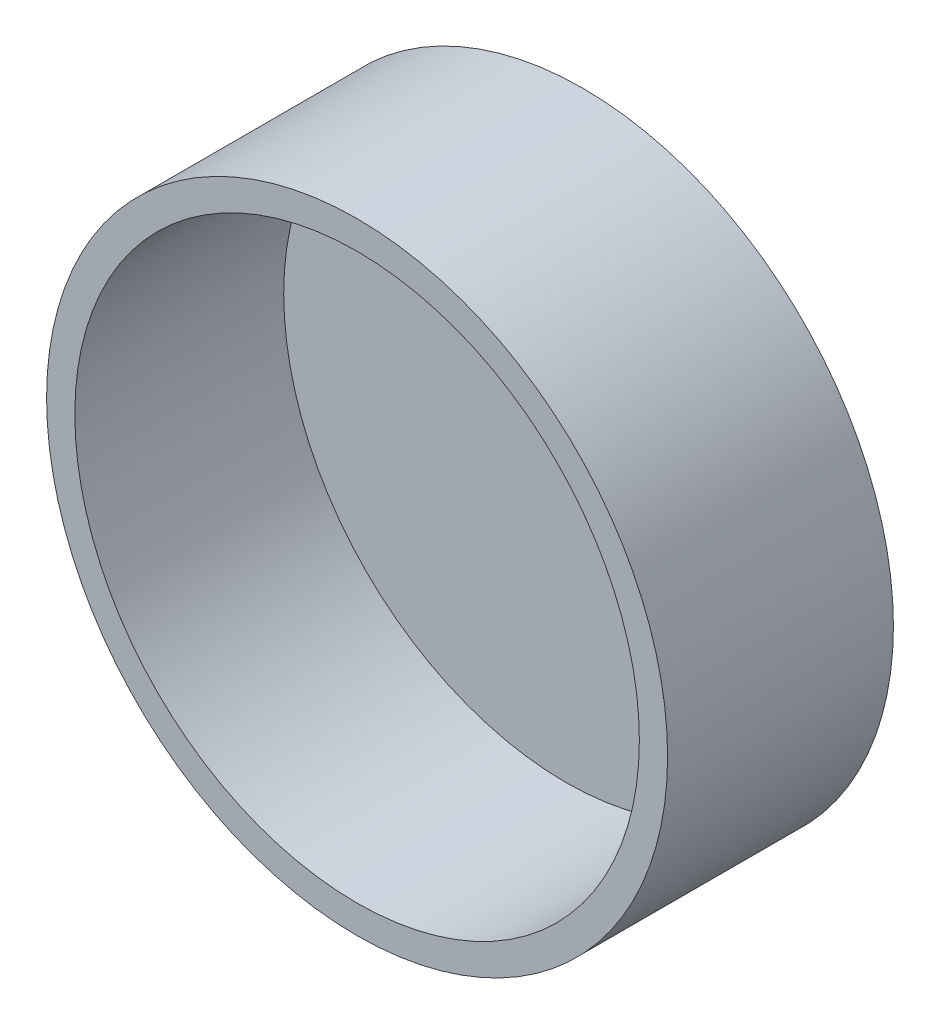
ISO-10303-21;
HEADER;
FILE_DESCRIPTION(('STEP AP214'),'2;1');
FILE_NAME('part.step','',(''),(''),'','','');
FILE_SCHEMA(('AUTOMOTIVE_DESIGN { 1 0 10303 214 1 1 1 1 }'));
ENDSEC;
DATA;
#1=APPLICATION_CONTEXT('core data for automotive mechanical design processes');
#2=APPLICATION_PROTOCOL_DEFINITION('international standard','automotive_design',2000,#1);
#3=PRODUCT_CONTEXT('',#1,'mechanical');
#4=PRODUCT('Part','Part','',(#3));
#5=PRODUCT_RELATED_PRODUCT_CATEGORY('part','',(#4));
#6=PRODUCT_DEFINITION_FORMATION('','',#4);
#7=PRODUCT_DEFINITION_CONTEXT('part definition',#1,'design');
#8=PRODUCT_DEFINITION('design','',#6,#7);
#9=PRODUCT_DEFINITION_SHAPE('','',#8);
#10=(LENGTH_UNIT() NAMED_UNIT(*) SI_UNIT(.MILLI.,.METRE.));
#11=(NAMED_UNIT(*) PLANE_ANGLE_UNIT() SI_UNIT($,.RADIAN.));
#12=(NAMED_UNIT(*) SI_UNIT($,.STERADIAN.) SOLID_ANGLE_UNIT());
#13=UNCERTAINTY_MEASURE_WITH_UNIT(LENGTH_MEASURE(1.E-05),#10,'distance_accuracy_value','');
#14=(GEOMETRIC_REPRESENTATION_CONTEXT(3) GLOBAL_UNCERTAINTY_ASSIGNED_CONTEXT((#13)) GLOBAL_UNIT_ASSIGNED_CONTEXT((#10,
#11,#12)) REPRESENTATION_CONTEXT('',''));
#15=CARTESIAN_POINT('',(0.,0.,0.));
#16=DIRECTION('',(0.,0.,1.));
#17=DIRECTION('',(1.,0.,0.));
#18=AXIS2_PLACEMENT_3D('',#15,#16,#17);
#19=CARTESIAN_POINT('',(-41.121809017845,65.,6.));
#20=DIRECTION('',(0.,0.,-1.));
#21=DIRECTION('',(-1.,0.,0.));
#22=AXIS2_PLACEMENT_3D('',#19,#20,#21);
#23=CYLINDRICAL_SURFACE('',#22,6.7);
#24=CARTESIAN_POINT('',(-41.121809017845,65.,6.));
#25=DIRECTION('',(0.,0.,1.));
#26=DIRECTION('',(1.,0.,0.));
#27=AXIS2_PLACEMENT_3D('',#24,#25,#26);
#28=CIRCLE('',#27,6.7);
#29=CARTESIAN_POINT('',(-34.421809017845,65.,6.));
#30=VERTEX_POINT('',#29);
#31=EDGE_CURVE('E45',#30,#30,#28,.T.);
#32=ORIENTED_EDGE('',*,*,#31,.T.);
#33=EDGE_LOOP('',(#32));
#34=FACE_BOUND('',#33,.T.);
#35=CARTESIAN_POINT('',(-41.121809017845,65.,0.));
#36=DIRECTION('',(0.,0.,1.));
#37=DIRECTION('',(1.,0.,0.));
#38=AXIS2_PLACEMENT_3D('',#35,#36,#37);
#39=CIRCLE('',#38,6.7);
#40=CARTESIAN_POINT('',(-34.421809017845,65.,0.));
#41=VERTEX_POINT('',#40);
#42=EDGE_CURVE('E41',#41,#41,#39,.T.);
#43=ORIENTED_EDGE('',*,*,#42,.F.);
#44=EDGE_LOOP('',(#43));
#45=FACE_BOUND('',#44,.T.);
#46=ADVANCED_FACE('F37',(#34,#45),#23,.F.);
#47=CARTESIAN_POINT('',(0.,65.,6.));
#48=DIRECTION('',(0.,0.,-1.));
#49=DIRECTION('',(-1.,0.,0.));
#50=AXIS2_PLACEMENT_3D('',#47,#48,#49);
#51=CYLINDRICAL_SURFACE('',#50,14.);
#52=CARTESIAN_POINT('',(0.,65.,6.));
#53=DIRECTION('',(0.,0.,1.));
#54=DIRECTION('',(1.,0.,0.));
#55=AXIS2_PLACEMENT_3D('',#52,#53,#54);
#56=CIRCLE('',#55,14.);
#57=CARTESIAN_POINT('',(14.,65.,6.));
#58=VERTEX_POINT('',#57);
#59=EDGE_CURVE('E50',#58,#58,#56,.T.);
#60=ORIENTED_EDGE('',*,*,#59,.T.);
#61=EDGE_LOOP('',(#60));
#62=FACE_BOUND('',#61,.T.);
#63=CARTESIAN_POINT('',(0.,65.,0.));
#64=DIRECTION('',(0.,0.,1.));
#65=DIRECTION('',(1.,0.,0.));
#66=AXIS2_PLACEMENT_3D('',#63,#64,#65);
#67=CIRCLE('',#66,14.);
#68=CARTESIAN_POINT('',(14.,65.,0.));
#69=VERTEX_POINT('',#68);
#70=EDGE_CURVE('E53',#69,#69,#67,.T.);
#71=ORIENTED_EDGE('',*,*,#70,.F.);
#72=EDGE_LOOP('',(#71));
#73=FACE_BOUND('',#72,.T.);
#74=ADVANCED_FACE('F39',(#62,#73),#51,.F.);
#75=CARTESIAN_POINT('',(41.121809017845,65.,6.));
#76=DIRECTION('',(0.,0.,-1.));
#77=DIRECTION('',(-1.,0.,0.));
#78=AXIS2_PLACEMENT_3D('',#75,#76,#77);
#79=CYLINDRICAL_SURFACE('',#78,6.90000000000001);
#80=CARTESIAN_POINT('',(41.121809017845,65.,6.));
#81=DIRECTION('',(0.,0.,1.));
#82=DIRECTION('',(1.,0.,0.));
#83=AXIS2_PLACEMENT_3D('',#80,#81,#82);
#84=CIRCLE('',#83,6.90000000000001);
#85=CARTESIAN_POINT('',(48.021809017845,65.,6.));
#86=VERTEX_POINT('',#85);
#87=EDGE_CURVE('E10',#86,#86,#84,.T.);
#88=ORIENTED_EDGE('',*,*,#87,.T.);
#89=EDGE_LOOP('',(#88));
#90=FACE_BOUND('',#89,.T.);
#91=CARTESIAN_POINT('',(41.121809017845,65.,-5.));
#92=DIRECTION('',(0.,0.,1.));
#93=DIRECTION('',(1.,0.,0.));
#94=AXIS2_PLACEMENT_3D('',#91,#92,#93);
#95=CIRCLE('',#94,6.90000000000001);
#96=CARTESIAN_POINT('',(48.021809017845,65.,-5.));
#97=VERTEX_POINT('',#96);
#98=EDGE_CURVE('E136',#97,#97,#95,.T.);
#99=ORIENTED_EDGE('',*,*,#98,.F.);
#100=EDGE_LOOP('',(#99));
#101=FACE_BOUND('',#100,.T.);
#102=ADVANCED_FACE('F78',(#90,#101),#79,.F.);
#103=CARTESIAN_POINT('',(0.,0.,6.));
#104=DIRECTION('',(0.,0.,1.));
#105=DIRECTION('',(1.,0.,0.));
#106=AXIS2_PLACEMENT_3D('',#103,#104,#105);
#107=PLANE('',#106);
#108=ORIENTED_EDGE('',*,*,#59,.F.);
#109=EDGE_LOOP('',(#108));
#110=FACE_BOUND('',#109,.T.);
#111=CARTESIAN_POINT('',(0.,0.,6.00000000000001));
#112=DIRECTION('',(0.,0.,1.));
#113=DIRECTION('',(1.,0.,0.));
#114=AXIS2_PLACEMENT_3D('',#111,#112,#113);
#115=CIRCLE('',#114,100.);
#116=CARTESIAN_POINT('',(100.,0.,6.00000000000001));
#117=VERTEX_POINT('',#116);
#118=EDGE_CURVE('E55',#117,#117,#115,.F.);
#119=ORIENTED_EDGE('',*,*,#118,.F.);
#120=EDGE_LOOP('',(#119));
#121=FACE_BOUND('',#120,.T.);
#122=ORIENTED_EDGE('',*,*,#31,.F.);
#123=EDGE_LOOP('',(#122));
#124=FACE_BOUND('',#123,.T.);
#125=ORIENTED_EDGE('',*,*,#87,.F.);
#126=EDGE_LOOP('',(#125));
#127=FACE_BOUND('',#126,.T.);
#128=ADVANCED_FACE('F74',(#110,#121,#124,#127),#107,.T.);
#129=CARTESIAN_POINT('',(0.,0.,0.));
#130=DIRECTION('',(0.,0.,1.));
#131=DIRECTION('',(1.,0.,0.));
#132=AXIS2_PLACEMENT_3D('',#129,#130,#131);
#133=PLANE('',#132);
#134=CARTESIAN_POINT('',(0.,65.,0.));
#135=DIRECTION('',(0.,0.,1.));
#136=DIRECTION('',(1.,0.,0.));
#137=AXIS2_PLACEMENT_3D('',#134,#135,#136);
#138=CIRCLE('',#137,17.);
#139=CARTESIAN_POINT('',(17.,65.,0.));
#140=VERTEX_POINT('',#139);
#141=EDGE_CURVE('E172',#140,#140,#138,.T.);
#142=ORIENTED_EDGE('',*,*,#141,.T.);
#143=EDGE_LOOP('',(#142));
#144=FACE_BOUND('',#143,.T.);
#145=CARTESIAN_POINT('',(-41.121809017845,65.,0.));
#146=DIRECTION('',(0.,0.,1.));
#147=DIRECTION('',(1.,0.,0.));
#148=AXIS2_PLACEMENT_3D('',#145,#146,#147);
#149=CIRCLE('',#148,10.);
#150=CARTESIAN_POINT('',(-31.121809017845,65.,0.));
#151=VERTEX_POINT('',#150);
#152=EDGE_CURVE('E146',#151,#151,#149,.T.);
#153=ORIENTED_EDGE('',*,*,#152,.T.);
#154=EDGE_LOOP('',(#153));
#155=FACE_BOUND('',#154,.T.);
#156=CARTESIAN_POINT('',(41.121809017845,65.,0.));
#157=DIRECTION('',(0.,0.,1.));
#158=DIRECTION('',(1.,0.,0.));
#159=AXIS2_PLACEMENT_3D('',#156,#157,#158);
#160=CIRCLE('',#159,10.);
#161=CARTESIAN_POINT('',(51.121809017845,65.,0.));
#162=VERTEX_POINT('',#161);
#163=EDGE_CURVE('E138',#162,#162,#160,.T.);
#164=ORIENTED_EDGE('',*,*,#163,.T.);
#165=EDGE_LOOP('',(#164));
#166=FACE_BOUND('',#165,.T.);
#167=CARTESIAN_POINT('',(0.,0.,0.));
#168=DIRECTION('',(0.,0.,1.));
#169=DIRECTION('',(1.,0.,0.));
#170=AXIS2_PLACEMENT_3D('',#167,#168,#169);
#171=CIRCLE('',#170,110.);
#172=CARTESIAN_POINT('',(110.,0.,0.));
#173=VERTEX_POINT('',#172);
#174=EDGE_CURVE('E68',#173,#173,#171,.T.);
#175=ORIENTED_EDGE('',*,*,#174,.F.);
#176=EDGE_LOOP('',(#175));
#177=FACE_BOUND('',#176,.T.);
#178=ADVANCED_FACE('F77',(#144,#155,#166,#177),#133,.F.);
#179=CARTESIAN_POINT('',(0.,0.,80.));
#180=DIRECTION('',(0.,0.,-1.));
#181=DIRECTION('',(-1.,0.,0.));
#182=AXIS2_PLACEMENT_3D('',#179,#180,#181);
#183=CYLINDRICAL_SURFACE('',#182,100.);
#184=ORIENTED_EDGE('',*,*,#118,.T.);
#185=EDGE_LOOP('',(#184));
#186=FACE_BOUND('',#185,.T.);
#187=CARTESIAN_POINT('',(0.,0.,80.));
#188=DIRECTION('',(0.,0.,1.));
#189=DIRECTION('',(1.,0.,0.));
#190=AXIS2_PLACEMENT_3D('',#187,#188,#189);
#191=CIRCLE('',#190,100.);
#192=CARTESIAN_POINT('',(100.,0.,80.));
#193=VERTEX_POINT('',#192);
#194=EDGE_CURVE('E65',#193,#193,#191,.T.);
#195=ORIENTED_EDGE('',*,*,#194,.T.);
#196=EDGE_LOOP('',(#195));
#197=FACE_BOUND('',#196,.T.);
#198=ADVANCED_FACE('F122',(#186,#197),#183,.F.);
#199=CARTESIAN_POINT('',(0.,0.,80.));
#200=DIRECTION('',(0.,0.,-1.));
#201=DIRECTION('',(-1.,0.,0.));
#202=AXIS2_PLACEMENT_3D('',#199,#200,#201);
#203=CYLINDRICAL_SURFACE('',#202,110.);
#204=CARTESIAN_POINT('',(0.,0.,80.));
#205=DIRECTION('',(0.,0.,1.));
#206=DIRECTION('',(1.,0.,0.));
#207=AXIS2_PLACEMENT_3D('',#204,#205,#206);
#208=CIRCLE('',#207,110.);
#209=CARTESIAN_POINT('',(110.,0.,80.));
#210=VERTEX_POINT('',#209);
#211=EDGE_CURVE('E60',#210,#210,#208,.T.);
#212=ORIENTED_EDGE('',*,*,#211,.F.);
#213=EDGE_LOOP('',(#212));
#214=FACE_BOUND('',#213,.T.);
#215=ORIENTED_EDGE('',*,*,#174,.T.);
#216=EDGE_LOOP('',(#215));
#217=FACE_BOUND('',#216,.T.);
#218=ADVANCED_FACE('F118',(#214,#217),#203,.T.);
#219=CARTESIAN_POINT('',(0.,0.,80.));
#220=DIRECTION('',(0.,0.,1.));
#221=DIRECTION('',(1.,0.,0.));
#222=AXIS2_PLACEMENT_3D('',#219,#220,#221);
#223=PLANE('',#222);
#224=ORIENTED_EDGE('',*,*,#194,.F.);
#225=EDGE_LOOP('',(#224));
#226=FACE_BOUND('',#225,.T.);
#227=ORIENTED_EDGE('',*,*,#211,.T.);
#228=EDGE_LOOP('',(#227));
#229=FACE_BOUND('',#228,.T.);
#230=ADVANCED_FACE('F114',(#226,#229),#223,.T.);
#231=CARTESIAN_POINT('',(41.121809017845,65.,-5.));
#232=DIRECTION('',(0.,0.,1.));
#233=DIRECTION('',(1.,0.,0.));
#234=AXIS2_PLACEMENT_3D('',#231,#232,#233);
#235=CYLINDRICAL_SURFACE('',#234,10.);
#236=CARTESIAN_POINT('',(41.121809017845,65.,-5.));
#237=DIRECTION('',(0.,0.,1.));
#238=DIRECTION('',(1.,0.,0.));
#239=AXIS2_PLACEMENT_3D('',#236,#237,#238);
#240=CIRCLE('',#239,10.);
#241=CARTESIAN_POINT('',(51.121809017845,65.,-5.));
#242=VERTEX_POINT('',#241);
#243=EDGE_CURVE('E137',#242,#242,#240,.T.);
#244=ORIENTED_EDGE('',*,*,#243,.T.);
#245=EDGE_LOOP('',(#244));
#246=FACE_BOUND('',#245,.T.);
#247=ORIENTED_EDGE('',*,*,#163,.F.);
#248=EDGE_LOOP('',(#247));
#249=FACE_BOUND('',#248,.T.);
#250=ADVANCED_FACE('F101',(#246,#249),#235,.T.);
#251=CARTESIAN_POINT('',(0.,0.,-5.));
#252=DIRECTION('',(0.,0.,1.));
#253=DIRECTION('',(1.,0.,0.));
#254=AXIS2_PLACEMENT_3D('',#251,#252,#253);
#255=PLANE('',#254);
#256=ORIENTED_EDGE('',*,*,#98,.T.);
#257=EDGE_LOOP('',(#256));
#258=FACE_BOUND('',#257,.T.);
#259=ORIENTED_EDGE('',*,*,#243,.F.);
#260=EDGE_LOOP('',(#259));
#261=FACE_BOUND('',#260,.T.);
#262=ADVANCED_FACE('F91',(#258,#261),#255,.F.);
#263=CARTESIAN_POINT('',(0.,0.,0.));
#264=DIRECTION('',(0.,0.,1.));
#265=DIRECTION('',(1.,0.,0.));
#266=AXIS2_PLACEMENT_3D('',#263,#264,#265);
#267=PLANE('',#266);
#268=CARTESIAN_POINT('',(-41.121809017845,65.,0.));
#269=DIRECTION('',(0.,0.,1.));
#270=DIRECTION('',(1.,0.,0.));
#271=AXIS2_PLACEMENT_3D('',#268,#269,#270);
#272=CIRCLE('',#271,3.);
#273=CARTESIAN_POINT('',(-38.121809017845,65.,0.));
#274=VERTEX_POINT('',#273);
#275=EDGE_CURVE('E160',#274,#274,#272,.T.);
#276=ORIENTED_EDGE('',*,*,#275,.F.);
#277=EDGE_LOOP('',(#276));
#278=FACE_BOUND('',#277,.T.);
#279=ORIENTED_EDGE('',*,*,#42,.T.);
#280=EDGE_LOOP('',(#279));
#281=FACE_BOUND('',#280,.T.);
#282=ADVANCED_FACE('F88',(#278,#281),#267,.T.);
#283=CARTESIAN_POINT('',(-41.121809017845,65.,-5.));
#284=DIRECTION('',(0.,0.,1.));
#285=DIRECTION('',(1.,0.,0.));
#286=AXIS2_PLACEMENT_3D('',#283,#284,#285);
#287=CYLINDRICAL_SURFACE('',#286,3.);
#288=CARTESIAN_POINT('',(-41.121809017845,65.,-5.));
#289=DIRECTION('',(0.,0.,1.));
#290=DIRECTION('',(1.,0.,0.));
#291=AXIS2_PLACEMENT_3D('',#288,#289,#290);
#292=CIRCLE('',#291,3.);
#293=CARTESIAN_POINT('',(-38.121809017845,65.,-5.));
#294=VERTEX_POINT('',#293);
#295=EDGE_CURVE('E159',#294,#294,#292,.T.);
#296=ORIENTED_EDGE('',*,*,#295,.F.);
#297=EDGE_LOOP('',(#296));
#298=FACE_BOUND('',#297,.T.);
#299=ORIENTED_EDGE('',*,*,#275,.T.);
#300=EDGE_LOOP('',(#299));
#301=FACE_BOUND('',#300,.T.);
#302=ADVANCED_FACE('F90',(#298,#301),#287,.F.);
#303=CARTESIAN_POINT('',(-41.121809017845,65.,-5.));
#304=DIRECTION('',(0.,0.,1.));
#305=DIRECTION('',(1.,0.,0.));
#306=AXIS2_PLACEMENT_3D('',#303,#304,#305);
#307=CYLINDRICAL_SURFACE('',#306,10.);
#308=CARTESIAN_POINT('',(-41.121809017845,65.,-5.));
#309=DIRECTION('',(0.,0.,1.));
#310=DIRECTION('',(1.,0.,0.));
#311=AXIS2_PLACEMENT_3D('',#308,#309,#310);
#312=CIRCLE('',#311,10.);
#313=CARTESIAN_POINT('',(-31.121809017845,65.,-5.));
#314=VERTEX_POINT('',#313);
#315=EDGE_CURVE('E143',#314,#314,#312,.T.);
#316=ORIENTED_EDGE('',*,*,#315,.T.);
#317=EDGE_LOOP('',(#316));
#318=FACE_BOUND('',#317,.T.);
#319=ORIENTED_EDGE('',*,*,#152,.F.);
#320=EDGE_LOOP('',(#319));
#321=FACE_BOUND('',#320,.T.);
#322=ADVANCED_FACE('F98',(#318,#321),#307,.T.);
#323=CARTESIAN_POINT('',(0.,0.,-5.));
#324=DIRECTION('',(0.,0.,1.));
#325=DIRECTION('',(1.,0.,0.));
#326=AXIS2_PLACEMENT_3D('',#323,#324,#325);
#327=PLANE('',#326);
#328=ORIENTED_EDGE('',*,*,#295,.T.);
#329=EDGE_LOOP('',(#328));
#330=FACE_BOUND('',#329,.T.);
#331=ORIENTED_EDGE('',*,*,#315,.F.);
#332=EDGE_LOOP('',(#331));
#333=FACE_BOUND('',#332,.T.);
#334=ADVANCED_FACE('F107',(#330,#333),#327,.F.);
#335=CARTESIAN_POINT('',(0.,0.,0.));
#336=DIRECTION('',(0.,0.,1.));
#337=DIRECTION('',(1.,0.,0.));
#338=AXIS2_PLACEMENT_3D('',#335,#336,#337);
#339=PLANE('',#338);
#340=CARTESIAN_POINT('',(0.,65.,0.));
#341=DIRECTION('',(0.,0.,1.));
#342=DIRECTION('',(1.,0.,0.));
#343=AXIS2_PLACEMENT_3D('',#340,#341,#342);
#344=CIRCLE('',#343,10.75);
#345=CARTESIAN_POINT('',(10.75,65.,0.));
#346=VERTEX_POINT('',#345);
#347=EDGE_CURVE('E168',#346,#346,#344,.T.);
#348=ORIENTED_EDGE('',*,*,#347,.F.);
#349=EDGE_LOOP('',(#348));
#350=FACE_BOUND('',#349,.T.);
#351=ORIENTED_EDGE('',*,*,#70,.T.);
#352=EDGE_LOOP('',(#351));
#353=FACE_BOUND('',#352,.T.);
#354=ADVANCED_FACE('F195',(#350,#353),#339,.T.);
#355=CARTESIAN_POINT('',(0.,65.,-5.));
#356=DIRECTION('',(0.,0.,1.));
#357=DIRECTION('',(1.,0.,0.));
#358=AXIS2_PLACEMENT_3D('',#355,#356,#357);
#359=CYLINDRICAL_SURFACE('',#358,17.);
#360=CARTESIAN_POINT('',(0.,65.,-5.));
#361=DIRECTION('',(0.,0.,1.));
#362=DIRECTION('',(1.,0.,0.));
#363=AXIS2_PLACEMENT_3D('',#360,#361,#362);
#364=CIRCLE('',#363,17.);
#365=CARTESIAN_POINT('',(17.,65.,-5.));
#366=VERTEX_POINT('',#365);
#367=EDGE_CURVE('E171',#366,#366,#364,.T.);
#368=ORIENTED_EDGE('',*,*,#367,.T.);
#369=EDGE_LOOP('',(#368));
#370=FACE_BOUND('',#369,.T.);
#371=ORIENTED_EDGE('',*,*,#141,.F.);
#372=EDGE_LOOP('',(#371));
#373=FACE_BOUND('',#372,.T.);
#374=ADVANCED_FACE('F180',(#370,#373),#359,.T.);
#375=CARTESIAN_POINT('',(0.,65.,-5.));
#376=DIRECTION('',(0.,0.,1.));
#377=DIRECTION('',(1.,0.,0.));
#378=AXIS2_PLACEMENT_3D('',#375,#376,#377);
#379=CYLINDRICAL_SURFACE('',#378,10.75);
#380=CARTESIAN_POINT('',(0.,65.,-5.));
#381=DIRECTION('',(0.,0.,1.));
#382=DIRECTION('',(1.,0.,0.));
#383=AXIS2_PLACEMENT_3D('',#380,#381,#382);
#384=CIRCLE('',#383,10.75);
#385=CARTESIAN_POINT('',(10.75,65.,-5.));
#386=VERTEX_POINT('',#385);
#387=EDGE_CURVE('E163',#386,#386,#384,.T.);
#388=ORIENTED_EDGE('',*,*,#387,.F.);
#389=EDGE_LOOP('',(#388));
#390=FACE_BOUND('',#389,.T.);
#391=ORIENTED_EDGE('',*,*,#347,.T.);
#392=EDGE_LOOP('',(#391));
#393=FACE_BOUND('',#392,.T.);
#394=ADVANCED_FACE('F186',(#390,#393),#379,.F.);
#395=CARTESIAN_POINT('',(0.,0.,-5.));
#396=DIRECTION('',(0.,0.,1.));
#397=DIRECTION('',(1.,0.,0.));
#398=AXIS2_PLACEMENT_3D('',#395,#396,#397);
#399=PLANE('',#398);
#400=ORIENTED_EDGE('',*,*,#367,.F.);
#401=EDGE_LOOP('',(#400));
#402=FACE_BOUND('',#401,.T.);
#403=ORIENTED_EDGE('',*,*,#387,.T.);
#404=EDGE_LOOP('',(#403));
#405=FACE_BOUND('',#404,.T.);
#406=ADVANCED_FACE('F183',(#402,#405),#399,.F.);
#407=CLOSED_SHELL('',(#46,#74,#102,#128,#178,#198,#218,#230,#250,#262,#282,#302,#322,#334,#354,
#374,#394,#406));
#408=MANIFOLD_SOLID_BREP('B2',#407);
#409=ADVANCED_BREP_SHAPE_REPRESENTATION('',(#18,#408),#14);
#410=SHAPE_DEFINITION_REPRESENTATION(#9,#409);
ENDSEC;
END-ISO-10303-21;
